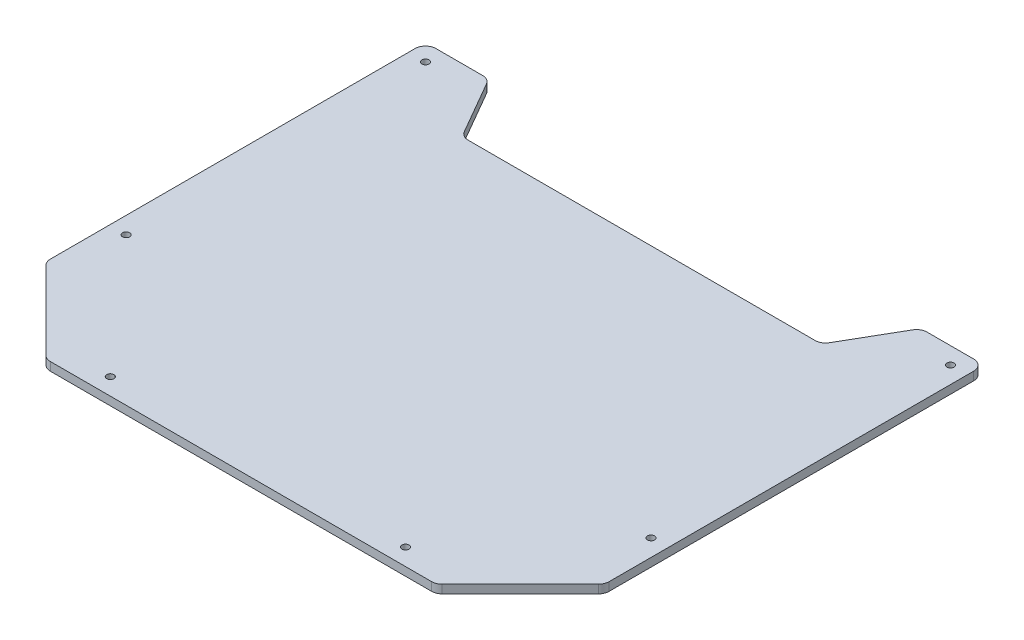
ISO-10303-21;
HEADER;
FILE_DESCRIPTION(('STEP AP214'),'2;1');
FILE_NAME('part.step','',(''),(''),'','','');
FILE_SCHEMA(('AUTOMOTIVE_DESIGN { 1 0 10303 214 1 1 1 1 }'));
ENDSEC;
DATA;
#1=APPLICATION_CONTEXT('core data for automotive mechanical design processes');
#2=APPLICATION_PROTOCOL_DEFINITION('international standard','automotive_design',2000,#1);
#3=PRODUCT_CONTEXT('',#1,'mechanical');
#4=PRODUCT('Part','Part','',(#3));
#5=PRODUCT_RELATED_PRODUCT_CATEGORY('part','',(#4));
#6=PRODUCT_DEFINITION_FORMATION('','',#4);
#7=PRODUCT_DEFINITION_CONTEXT('part definition',#1,'design');
#8=PRODUCT_DEFINITION('design','',#6,#7);
#9=PRODUCT_DEFINITION_SHAPE('','',#8);
#10=(LENGTH_UNIT() NAMED_UNIT(*) SI_UNIT(.MILLI.,.METRE.));
#11=(NAMED_UNIT(*) PLANE_ANGLE_UNIT() SI_UNIT($,.RADIAN.));
#12=(NAMED_UNIT(*) SI_UNIT($,.STERADIAN.) SOLID_ANGLE_UNIT());
#13=UNCERTAINTY_MEASURE_WITH_UNIT(LENGTH_MEASURE(1.E-05),#10,'distance_accuracy_value','');
#14=(GEOMETRIC_REPRESENTATION_CONTEXT(3) GLOBAL_UNCERTAINTY_ASSIGNED_CONTEXT((#13)) GLOBAL_UNIT_ASSIGNED_CONTEXT((#10,
#11,#12)) REPRESENTATION_CONTEXT('',''));
#15=CARTESIAN_POINT('',(0.,0.,0.));
#16=DIRECTION('',(0.,0.,1.));
#17=DIRECTION('',(1.,0.,0.));
#18=AXIS2_PLACEMENT_3D('',#15,#16,#17);
#19=CARTESIAN_POINT('',(0.,4.,0.));
#20=DIRECTION('',(0.,-1.,0.));
#21=DIRECTION('',(0.,0.,-1.));
#22=AXIS2_PLACEMENT_3D('',#19,#20,#21);
#23=PLANE('',#22);
#24=CARTESIAN_POINT('',(-70.,4.,-8.));
#25=DIRECTION('',(0.,1.,0.));
#26=DIRECTION('',(0.,0.,1.));
#27=AXIS2_PLACEMENT_3D('',#24,#25,#26);
#28=CIRCLE('',#27,1.69999999999999);
#29=CARTESIAN_POINT('',(-70.,4.,-6.30000000000001));
#30=VERTEX_POINT('',#29);
#31=EDGE_CURVE('E229',#30,#30,#28,.T.);
#32=ORIENTED_EDGE('',*,*,#31,.F.);
#33=EDGE_LOOP('',(#32));
#34=FACE_BOUND('',#33,.T.);
#35=CARTESIAN_POINT('',(70.,4.,-8.));
#36=DIRECTION('',(0.,1.,0.));
#37=DIRECTION('',(0.,0.,1.));
#38=AXIS2_PLACEMENT_3D('',#35,#36,#37);
#39=CIRCLE('',#38,1.69999999999999);
#40=CARTESIAN_POINT('',(70.,4.,-6.30000000000001));
#41=VERTEX_POINT('',#40);
#42=EDGE_CURVE('E224',#41,#41,#39,.T.);
#43=ORIENTED_EDGE('',*,*,#42,.F.);
#44=EDGE_LOOP('',(#43));
#45=FACE_BOUND('',#44,.T.);
#46=CARTESIAN_POINT('',(124.5,4.,-70.));
#47=DIRECTION('',(0.,1.,0.));
#48=DIRECTION('',(0.,0.,1.));
#49=AXIS2_PLACEMENT_3D('',#46,#47,#48);
#50=CIRCLE('',#49,1.69999999999998);
#51=CARTESIAN_POINT('',(124.5,4.,-68.3));
#52=VERTEX_POINT('',#51);
#53=EDGE_CURVE('E223',#52,#52,#50,.T.);
#54=ORIENTED_EDGE('',*,*,#53,.F.);
#55=EDGE_LOOP('',(#54));
#56=FACE_BOUND('',#55,.T.);
#57=CARTESIAN_POINT('',(124.5,4.,-212.));
#58=DIRECTION('',(0.,1.,0.));
#59=DIRECTION('',(0.,0.,1.));
#60=AXIS2_PLACEMENT_3D('',#57,#58,#59);
#61=CIRCLE('',#60,1.69999999999998);
#62=CARTESIAN_POINT('',(124.5,4.,-210.3));
#63=VERTEX_POINT('',#62);
#64=EDGE_CURVE('E492',#63,#63,#61,.T.);
#65=ORIENTED_EDGE('',*,*,#64,.F.);
#66=EDGE_LOOP('',(#65));
#67=FACE_BOUND('',#66,.T.);
#68=CARTESIAN_POINT('',(-124.5,4.,-212.));
#69=DIRECTION('',(0.,1.,0.));
#70=DIRECTION('',(0.,0.,1.));
#71=AXIS2_PLACEMENT_3D('',#68,#69,#70);
#72=CIRCLE('',#71,1.69999999999999);
#73=CARTESIAN_POINT('',(-124.5,4.,-210.3));
#74=VERTEX_POINT('',#73);
#75=EDGE_CURVE('E486',#74,#74,#72,.T.);
#76=ORIENTED_EDGE('',*,*,#75,.F.);
#77=EDGE_LOOP('',(#76));
#78=FACE_BOUND('',#77,.T.);
#79=DIRECTION('',(0.707106781186548,0.,-0.707106781186547));
#80=VECTOR('',#79,1.);
#81=CARTESIAN_POINT('',(92.5,4.,0.));
#82=LINE('',#81,#80);
#83=CARTESIAN_POINT('',(93.9644660940673,4.,-1.46446609406726));
#84=VERTEX_POINT('',#83);
#85=CARTESIAN_POINT('',(131.035533905933,4.,-38.5355339059327));
#86=VERTEX_POINT('',#85);
#87=EDGE_CURVE('E391',#84,#86,#82,.T.);
#88=ORIENTED_EDGE('',*,*,#87,.T.);
#89=CARTESIAN_POINT('',(127.5,4.,-42.0710678118655));
#90=DIRECTION('',(0.,-1.,0.));
#91=DIRECTION('',(0.,0.,-1.));
#92=AXIS2_PLACEMENT_3D('',#89,#90,#91);
#93=CIRCLE('',#92,5.);
#94=CARTESIAN_POINT('',(132.5,4.,-42.0710678118655));
#95=VERTEX_POINT('',#94);
#96=EDGE_CURVE('E276',#86,#95,#93,.F.);
#97=ORIENTED_EDGE('',*,*,#96,.T.);
#98=DIRECTION('',(0.,0.,-1.));
#99=VECTOR('',#98,1.);
#100=CARTESIAN_POINT('',(132.5,4.,-40.));
#101=LINE('',#100,#99);
#102=CARTESIAN_POINT('',(132.5,4.,-215.));
#103=VERTEX_POINT('',#102);
#104=EDGE_CURVE('E199',#95,#103,#101,.T.);
#105=ORIENTED_EDGE('',*,*,#104,.T.);
#106=CARTESIAN_POINT('',(127.5,4.,-215.));
#107=DIRECTION('',(0.,-1.,0.));
#108=DIRECTION('',(0.,0.,-1.));
#109=AXIS2_PLACEMENT_3D('',#106,#107,#108);
#110=CIRCLE('',#109,5.);
#111=CARTESIAN_POINT('',(127.5,4.,-220.));
#112=VERTEX_POINT('',#111);
#113=EDGE_CURVE('E256',#103,#112,#110,.F.);
#114=ORIENTED_EDGE('',*,*,#113,.T.);
#115=DIRECTION('',(-1.,0.,0.));
#116=VECTOR('',#115,1.);
#117=CARTESIAN_POINT('',(132.5,4.,-220.));
#118=LINE('',#117,#116);
#119=CARTESIAN_POINT('',(105.386751345948,4.,-220.));
#120=VERTEX_POINT('',#119);
#121=EDGE_CURVE('E207',#112,#120,#118,.T.);
#122=ORIENTED_EDGE('',*,*,#121,.T.);
#123=CARTESIAN_POINT('',(105.386751345948,4.,-215.));
#124=DIRECTION('',(0.,-1.,0.));
#125=DIRECTION('',(0.,0.,-1.));
#126=AXIS2_PLACEMENT_3D('',#123,#124,#125);
#127=CIRCLE('',#126,5.);
#128=CARTESIAN_POINT('',(101.056624327026,4.,-217.5));
#129=VERTEX_POINT('',#128);
#130=EDGE_CURVE('E259',#120,#129,#127,.F.);
#131=ORIENTED_EDGE('',*,*,#130,.T.);
#132=DIRECTION('',(-0.500000000000004,0.,0.866025403784436));
#133=VECTOR('',#132,1.);
#134=CARTESIAN_POINT('',(102.5,4.,-220.));
#135=LINE('',#134,#133);
#136=CARTESIAN_POINT('',(86.6228675972851,4.,-192.5));
#137=VERTEX_POINT('',#136);
#138=EDGE_CURVE('E213',#129,#137,#135,.T.);
#139=ORIENTED_EDGE('',*,*,#138,.T.);
#140=CARTESIAN_POINT('',(82.2927405783629,4.,-195.));
#141=DIRECTION('',(0.,-1.,0.));
#142=DIRECTION('',(0.,0.,-1.));
#143=AXIS2_PLACEMENT_3D('',#140,#141,#142);
#144=CIRCLE('',#143,5.);
#145=CARTESIAN_POINT('',(82.2927405783629,4.,-190.));
#146=VERTEX_POINT('',#145);
#147=EDGE_CURVE('E11',#137,#146,#144,.T.);
#148=ORIENTED_EDGE('',*,*,#147,.T.);
#149=DIRECTION('',(-1.,0.,0.));
#150=VECTOR('',#149,1.);
#151=CARTESIAN_POINT('',(85.179491924311,4.,-190.));
#152=LINE('',#151,#150);
#153=CARTESIAN_POINT('',(-82.2927405783629,4.,-190.));
#154=VERTEX_POINT('',#153);
#155=EDGE_CURVE('E363',#146,#154,#152,.T.);
#156=ORIENTED_EDGE('',*,*,#155,.T.);
#157=CARTESIAN_POINT('',(-82.2927405783629,4.,-195.));
#158=DIRECTION('',(0.,-1.,0.));
#159=DIRECTION('',(0.,0.,-1.));
#160=AXIS2_PLACEMENT_3D('',#157,#158,#159);
#161=CIRCLE('',#160,5.);
#162=CARTESIAN_POINT('',(-86.6228675972851,4.,-192.5));
#163=VERTEX_POINT('',#162);
#164=EDGE_CURVE('E337',#154,#163,#161,.T.);
#165=ORIENTED_EDGE('',*,*,#164,.T.);
#166=DIRECTION('',(-0.500000000000004,0.,-0.866025403784436));
#167=VECTOR('',#166,1.);
#168=CARTESIAN_POINT('',(-102.5,4.,-220.));
#169=LINE('',#168,#167);
#170=CARTESIAN_POINT('',(-101.056624327026,4.,-217.5));
#171=VERTEX_POINT('',#170);
#172=EDGE_CURVE('E369',#163,#171,#169,.T.);
#173=ORIENTED_EDGE('',*,*,#172,.T.);
#174=CARTESIAN_POINT('',(-105.386751345948,4.,-215.));
#175=DIRECTION('',(0.,-1.,0.));
#176=DIRECTION('',(0.,0.,-1.));
#177=AXIS2_PLACEMENT_3D('',#174,#175,#176);
#178=CIRCLE('',#177,5.);
#179=CARTESIAN_POINT('',(-105.386751345948,4.,-220.));
#180=VERTEX_POINT('',#179);
#181=EDGE_CURVE('E262',#171,#180,#178,.F.);
#182=ORIENTED_EDGE('',*,*,#181,.T.);
#183=DIRECTION('',(-1.,0.,0.));
#184=VECTOR('',#183,1.);
#185=CARTESIAN_POINT('',(-132.5,4.,-220.));
#186=LINE('',#185,#184);
#187=CARTESIAN_POINT('',(-127.5,4.,-220.));
#188=VERTEX_POINT('',#187);
#189=EDGE_CURVE('E374',#180,#188,#186,.T.);
#190=ORIENTED_EDGE('',*,*,#189,.T.);
#191=CARTESIAN_POINT('',(-127.5,4.,-215.));
#192=DIRECTION('',(0.,-1.,0.));
#193=DIRECTION('',(0.,0.,-1.));
#194=AXIS2_PLACEMENT_3D('',#191,#192,#193);
#195=CIRCLE('',#194,5.);
#196=CARTESIAN_POINT('',(-132.5,4.,-215.));
#197=VERTEX_POINT('',#196);
#198=EDGE_CURVE('E265',#188,#197,#195,.F.);
#199=ORIENTED_EDGE('',*,*,#198,.T.);
#200=DIRECTION('',(0.,0.,1.));
#201=VECTOR('',#200,1.);
#202=CARTESIAN_POINT('',(-132.5,4.,-40.));
#203=LINE('',#202,#201);
#204=CARTESIAN_POINT('',(-132.5,4.,-42.0710678118655));
#205=VERTEX_POINT('',#204);
#206=EDGE_CURVE('E381',#197,#205,#203,.T.);
#207=ORIENTED_EDGE('',*,*,#206,.T.);
#208=CARTESIAN_POINT('',(-127.5,4.,-42.0710678118655));
#209=DIRECTION('',(0.,-1.,0.));
#210=DIRECTION('',(0.,0.,-1.));
#211=AXIS2_PLACEMENT_3D('',#208,#209,#210);
#212=CIRCLE('',#211,5.);
#213=CARTESIAN_POINT('',(-131.035533905933,4.,-38.5355339059327));
#214=VERTEX_POINT('',#213);
#215=EDGE_CURVE('E268',#205,#214,#212,.F.);
#216=ORIENTED_EDGE('',*,*,#215,.T.);
#217=DIRECTION('',(0.707106781186548,0.,0.707106781186547));
#218=VECTOR('',#217,1.);
#219=CARTESIAN_POINT('',(-92.5,4.,0.));
#220=LINE('',#219,#218);
#221=CARTESIAN_POINT('',(-93.9644660940673,4.,-1.46446609406726));
#222=VERTEX_POINT('',#221);
#223=EDGE_CURVE('E385',#214,#222,#220,.T.);
#224=ORIENTED_EDGE('',*,*,#223,.T.);
#225=CARTESIAN_POINT('',(-90.4289321881345,4.,-5.));
#226=DIRECTION('',(0.,-1.,0.));
#227=DIRECTION('',(0.,0.,-1.));
#228=AXIS2_PLACEMENT_3D('',#225,#226,#227);
#229=CIRCLE('',#228,5.);
#230=CARTESIAN_POINT('',(-90.4289321881345,4.,0.));
#231=VERTEX_POINT('',#230);
#232=EDGE_CURVE('E62',#222,#231,#229,.F.);
#233=ORIENTED_EDGE('',*,*,#232,.T.);
#234=DIRECTION('',(1.,0.,0.));
#235=VECTOR('',#234,1.);
#236=CARTESIAN_POINT('',(-92.5,4.,0.));
#237=LINE('',#236,#235);
#238=CARTESIAN_POINT('',(90.4289321881345,4.,0.));
#239=VERTEX_POINT('',#238);
#240=EDGE_CURVE('E388',#231,#239,#237,.T.);
#241=ORIENTED_EDGE('',*,*,#240,.T.);
#242=CARTESIAN_POINT('',(90.4289321881345,4.,-5.));
#243=DIRECTION('',(0.,-1.,0.));
#244=DIRECTION('',(0.,0.,-1.));
#245=AXIS2_PLACEMENT_3D('',#242,#243,#244);
#246=CIRCLE('',#245,5.);
#247=EDGE_CURVE('E273',#239,#84,#246,.F.);
#248=ORIENTED_EDGE('',*,*,#247,.T.);
#249=EDGE_LOOP('',(#88,#97,#105,#114,#122,#131,#139,#148,#156,#165,#173,#182,#190,#199,#207,
#216,#224,#233,#241,#248));
#250=FACE_BOUND('',#249,.T.);
#251=CARTESIAN_POINT('',(-124.5,4.,-70.));
#252=DIRECTION('',(0.,1.,0.));
#253=DIRECTION('',(0.,0.,1.));
#254=AXIS2_PLACEMENT_3D('',#251,#252,#253);
#255=CIRCLE('',#254,1.69999999999999);
#256=CARTESIAN_POINT('',(-124.5,4.,-68.3));
#257=VERTEX_POINT('',#256);
#258=EDGE_CURVE('E478',#257,#257,#255,.T.);
#259=ORIENTED_EDGE('',*,*,#258,.F.);
#260=EDGE_LOOP('',(#259));
#261=FACE_BOUND('',#260,.T.);
#262=ADVANCED_FACE('F39',(#34,#45,#56,#67,#78,#250,#261),#23,.F.);
#263=CARTESIAN_POINT('',(132.5,4.,-220.));
#264=DIRECTION('',(0.,0.,1.));
#265=DIRECTION('',(1.,0.,0.));
#266=AXIS2_PLACEMENT_3D('',#263,#264,#265);
#267=PLANE('',#266);
#268=DIRECTION('',(-1.,0.,0.));
#269=VECTOR('',#268,1.);
#270=CARTESIAN_POINT('',(132.5,0.,-220.));
#271=LINE('',#270,#269);
#272=CARTESIAN_POINT('',(127.5,0.,-220.));
#273=VERTEX_POINT('',#272);
#274=CARTESIAN_POINT('',(105.386751345948,0.,-220.));
#275=VERTEX_POINT('',#274);
#276=EDGE_CURVE('E355',#273,#275,#271,.T.);
#277=ORIENTED_EDGE('',*,*,#276,.T.);
#278=DIRECTION('',(0.,-1.,0.));
#279=VECTOR('',#278,1.);
#280=CARTESIAN_POINT('',(105.386751345948,4.,-220.));
#281=LINE('',#280,#279);
#282=EDGE_CURVE('E331',#275,#120,#281,.F.);
#283=ORIENTED_EDGE('',*,*,#282,.T.);
#284=ORIENTED_EDGE('',*,*,#121,.F.);
#285=DIRECTION('',(0.,-1.,0.));
#286=VECTOR('',#285,1.);
#287=CARTESIAN_POINT('',(127.5,4.,-220.));
#288=LINE('',#287,#286);
#289=EDGE_CURVE('E327',#112,#273,#288,.T.);
#290=ORIENTED_EDGE('',*,*,#289,.T.);
#291=EDGE_LOOP('',(#277,#283,#284,#290));
#292=FACE_BOUND('',#291,.T.);
#293=ADVANCED_FACE('F438',(#292),#267,.F.);
#294=CARTESIAN_POINT('',(102.5,4.,-220.));
#295=DIRECTION('',(0.866025403784436,0.,0.500000000000004));
#296=DIRECTION('',(0.500000000000004,0.,-0.866025403784436));
#297=AXIS2_PLACEMENT_3D('',#294,#295,#296);
#298=PLANE('',#297);
#299=DIRECTION('',(-0.500000000000004,0.,0.866025403784436));
#300=VECTOR('',#299,1.);
#301=CARTESIAN_POINT('',(102.5,0.,-220.));
#302=LINE('',#301,#300);
#303=CARTESIAN_POINT('',(101.056624327026,0.,-217.5));
#304=VERTEX_POINT('',#303);
#305=CARTESIAN_POINT('',(86.6228675972851,0.,-192.5));
#306=VERTEX_POINT('',#305);
#307=EDGE_CURVE('E343',#304,#306,#302,.T.);
#308=ORIENTED_EDGE('',*,*,#307,.T.);
#309=DIRECTION('',(0.,-1.,0.));
#310=VECTOR('',#309,1.);
#311=CARTESIAN_POINT('',(86.6228675972851,4.,-192.5));
#312=LINE('',#311,#310);
#313=EDGE_CURVE('E324',#306,#137,#312,.F.);
#314=ORIENTED_EDGE('',*,*,#313,.T.);
#315=ORIENTED_EDGE('',*,*,#138,.F.);
#316=DIRECTION('',(0.,-1.,0.));
#317=VECTOR('',#316,1.);
#318=CARTESIAN_POINT('',(101.056624327026,4.,-217.5));
#319=LINE('',#318,#317);
#320=EDGE_CURVE('E320',#129,#304,#319,.T.);
#321=ORIENTED_EDGE('',*,*,#320,.T.);
#322=EDGE_LOOP('',(#308,#314,#315,#321));
#323=FACE_BOUND('',#322,.T.);
#324=ADVANCED_FACE('F350',(#323),#298,.F.);
#325=CARTESIAN_POINT('',(85.179491924311,4.,-190.));
#326=DIRECTION('',(0.,0.,1.));
#327=DIRECTION('',(1.,0.,0.));
#328=AXIS2_PLACEMENT_3D('',#325,#326,#327);
#329=PLANE('',#328);
#330=DIRECTION('',(-1.,0.,0.));
#331=VECTOR('',#330,1.);
#332=CARTESIAN_POINT('',(85.179491924311,0.,-190.));
#333=LINE('',#332,#331);
#334=CARTESIAN_POINT('',(82.2927405783629,0.,-190.));
#335=VERTEX_POINT('',#334);
#336=CARTESIAN_POINT('',(-82.2927405783629,0.,-190.));
#337=VERTEX_POINT('',#336);
#338=EDGE_CURVE('E345',#335,#337,#333,.T.);
#339=ORIENTED_EDGE('',*,*,#338,.T.);
#340=DIRECTION('',(0.,-1.,0.));
#341=VECTOR('',#340,1.);
#342=CARTESIAN_POINT('',(-82.2927405783629,4.,-190.));
#343=LINE('',#342,#341);
#344=EDGE_CURVE('E317',#337,#154,#343,.F.);
#345=ORIENTED_EDGE('',*,*,#344,.T.);
#346=ORIENTED_EDGE('',*,*,#155,.F.);
#347=DIRECTION('',(0.,-1.,0.));
#348=VECTOR('',#347,1.);
#349=CARTESIAN_POINT('',(82.2927405783629,0.,-190.));
#350=LINE('',#349,#348);
#351=EDGE_CURVE('E313',#146,#335,#350,.T.);
#352=ORIENTED_EDGE('',*,*,#351,.T.);
#353=EDGE_LOOP('',(#339,#345,#346,#352));
#354=FACE_BOUND('',#353,.T.);
#355=ADVANCED_FACE('F366',(#354),#329,.F.);
#356=CARTESIAN_POINT('',(-102.5,4.,-220.));
#357=DIRECTION('',(-0.866025403784436,0.,0.500000000000004));
#358=DIRECTION('',(0.500000000000004,0.,0.866025403784436));
#359=AXIS2_PLACEMENT_3D('',#356,#357,#358);
#360=PLANE('',#359);
#361=DIRECTION('',(-0.500000000000004,0.,-0.866025403784436));
#362=VECTOR('',#361,1.);
#363=CARTESIAN_POINT('',(-102.5,0.,-220.));
#364=LINE('',#363,#362);
#365=CARTESIAN_POINT('',(-86.6228675972851,0.,-192.5));
#366=VERTEX_POINT('',#365);
#367=CARTESIAN_POINT('',(-101.056624327026,0.,-217.5));
#368=VERTEX_POINT('',#367);
#369=EDGE_CURVE('E402',#366,#368,#364,.T.);
#370=ORIENTED_EDGE('',*,*,#369,.T.);
#371=DIRECTION('',(0.,-1.,0.));
#372=VECTOR('',#371,1.);
#373=CARTESIAN_POINT('',(-101.056624327026,4.,-217.5));
#374=LINE('',#373,#372);
#375=EDGE_CURVE('E310',#368,#171,#374,.F.);
#376=ORIENTED_EDGE('',*,*,#375,.T.);
#377=ORIENTED_EDGE('',*,*,#172,.F.);
#378=DIRECTION('',(0.,-1.,0.));
#379=VECTOR('',#378,1.);
#380=CARTESIAN_POINT('',(-86.6228675972851,0.,-192.5));
#381=LINE('',#380,#379);
#382=EDGE_CURVE('E306',#163,#366,#381,.T.);
#383=ORIENTED_EDGE('',*,*,#382,.T.);
#384=EDGE_LOOP('',(#370,#376,#377,#383));
#385=FACE_BOUND('',#384,.T.);
#386=ADVANCED_FACE('F582',(#385),#360,.F.);
#387=CARTESIAN_POINT('',(-132.5,4.,-220.));
#388=DIRECTION('',(0.,0.,1.));
#389=DIRECTION('',(1.,0.,0.));
#390=AXIS2_PLACEMENT_3D('',#387,#388,#389);
#391=PLANE('',#390);
#392=DIRECTION('',(-1.,0.,0.));
#393=VECTOR('',#392,1.);
#394=CARTESIAN_POINT('',(-132.5,0.,-220.));
#395=LINE('',#394,#393);
#396=CARTESIAN_POINT('',(-105.386751345948,0.,-220.));
#397=VERTEX_POINT('',#396);
#398=CARTESIAN_POINT('',(-127.5,0.,-220.));
#399=VERTEX_POINT('',#398);
#400=EDGE_CURVE('E406',#397,#399,#395,.T.);
#401=ORIENTED_EDGE('',*,*,#400,.T.);
#402=DIRECTION('',(0.,-1.,0.));
#403=VECTOR('',#402,1.);
#404=CARTESIAN_POINT('',(-127.5,4.,-220.));
#405=LINE('',#404,#403);
#406=EDGE_CURVE('E303',#399,#188,#405,.F.);
#407=ORIENTED_EDGE('',*,*,#406,.T.);
#408=ORIENTED_EDGE('',*,*,#189,.F.);
#409=DIRECTION('',(0.,-1.,0.));
#410=VECTOR('',#409,1.);
#411=CARTESIAN_POINT('',(-105.386751345948,4.,-220.));
#412=LINE('',#411,#410);
#413=EDGE_CURVE('E299',#180,#397,#412,.T.);
#414=ORIENTED_EDGE('',*,*,#413,.T.);
#415=EDGE_LOOP('',(#401,#407,#408,#414));
#416=FACE_BOUND('',#415,.T.);
#417=ADVANCED_FACE('F591',(#416),#391,.F.);
#418=CARTESIAN_POINT('',(-132.5,4.,-40.));
#419=DIRECTION('',(1.,0.,0.));
#420=DIRECTION('',(0.,0.,-1.));
#421=AXIS2_PLACEMENT_3D('',#418,#419,#420);
#422=PLANE('',#421);
#423=DIRECTION('',(0.,0.,1.));
#424=VECTOR('',#423,1.);
#425=CARTESIAN_POINT('',(-132.5,0.,-40.));
#426=LINE('',#425,#424);
#427=CARTESIAN_POINT('',(-132.5,0.,-215.));
#428=VERTEX_POINT('',#427);
#429=CARTESIAN_POINT('',(-132.5,0.,-42.0710678118655));
#430=VERTEX_POINT('',#429);
#431=EDGE_CURVE('E410',#428,#430,#426,.T.);
#432=ORIENTED_EDGE('',*,*,#431,.T.);
#433=DIRECTION('',(0.,-1.,0.));
#434=VECTOR('',#433,1.);
#435=CARTESIAN_POINT('',(-132.5,4.,-42.0710678118655));
#436=LINE('',#435,#434);
#437=EDGE_CURVE('E296',#430,#205,#436,.F.);
#438=ORIENTED_EDGE('',*,*,#437,.T.);
#439=ORIENTED_EDGE('',*,*,#206,.F.);
#440=DIRECTION('',(0.,-1.,0.));
#441=VECTOR('',#440,1.);
#442=CARTESIAN_POINT('',(-132.5,4.,-215.));
#443=LINE('',#442,#441);
#444=EDGE_CURVE('E292',#197,#428,#443,.T.);
#445=ORIENTED_EDGE('',*,*,#444,.T.);
#446=EDGE_LOOP('',(#432,#438,#439,#445));
#447=FACE_BOUND('',#446,.T.);
#448=ADVANCED_FACE('F601',(#447),#422,.F.);
#449=CARTESIAN_POINT('',(-92.5,4.,0.));
#450=DIRECTION('',(0.707106781186547,0.,-0.707106781186548));
#451=DIRECTION('',(-0.707106781186548,0.,-0.707106781186547));
#452=AXIS2_PLACEMENT_3D('',#449,#450,#451);
#453=PLANE('',#452);
#454=DIRECTION('',(0.707106781186548,0.,0.707106781186547));
#455=VECTOR('',#454,1.);
#456=CARTESIAN_POINT('',(-92.5,0.,0.));
#457=LINE('',#456,#455);
#458=CARTESIAN_POINT('',(-131.035533905933,0.,-38.5355339059327));
#459=VERTEX_POINT('',#458);
#460=CARTESIAN_POINT('',(-93.9644660940673,0.,-1.46446609406726));
#461=VERTEX_POINT('',#460);
#462=EDGE_CURVE('E414',#459,#461,#457,.T.);
#463=ORIENTED_EDGE('',*,*,#462,.T.);
#464=DIRECTION('',(0.,-1.,0.));
#465=VECTOR('',#464,1.);
#466=CARTESIAN_POINT('',(-93.9644660940673,4.,-1.46446609406726));
#467=LINE('',#466,#465);
#468=EDGE_CURVE('E289',#461,#222,#467,.F.);
#469=ORIENTED_EDGE('',*,*,#468,.T.);
#470=ORIENTED_EDGE('',*,*,#223,.F.);
#471=DIRECTION('',(0.,-1.,0.));
#472=VECTOR('',#471,1.);
#473=CARTESIAN_POINT('',(-131.035533905933,4.,-38.5355339059327));
#474=LINE('',#473,#472);
#475=EDGE_CURVE('E285',#214,#459,#474,.T.);
#476=ORIENTED_EDGE('',*,*,#475,.T.);
#477=EDGE_LOOP('',(#463,#469,#470,#476));
#478=FACE_BOUND('',#477,.T.);
#479=ADVANCED_FACE('F435',(#478),#453,.F.);
#480=CARTESIAN_POINT('',(-92.5,4.,0.));
#481=DIRECTION('',(0.,0.,-1.));
#482=DIRECTION('',(-1.,0.,0.));
#483=AXIS2_PLACEMENT_3D('',#480,#481,#482);
#484=PLANE('',#483);
#485=DIRECTION('',(1.,0.,0.));
#486=VECTOR('',#485,1.);
#487=CARTESIAN_POINT('',(-92.5,0.,0.));
#488=LINE('',#487,#486);
#489=CARTESIAN_POINT('',(-90.4289321881345,0.,0.));
#490=VERTEX_POINT('',#489);
#491=CARTESIAN_POINT('',(90.4289321881345,0.,0.));
#492=VERTEX_POINT('',#491);
#493=EDGE_CURVE('E215',#490,#492,#488,.T.);
#494=ORIENTED_EDGE('',*,*,#493,.T.);
#495=DIRECTION('',(0.,-1.,0.));
#496=VECTOR('',#495,1.);
#497=CARTESIAN_POINT('',(90.4289321881345,4.,0.));
#498=LINE('',#497,#496);
#499=EDGE_CURVE('E55',#492,#239,#498,.F.);
#500=ORIENTED_EDGE('',*,*,#499,.T.);
#501=ORIENTED_EDGE('',*,*,#240,.F.);
#502=DIRECTION('',(0.,-1.,0.));
#503=VECTOR('',#502,1.);
#504=CARTESIAN_POINT('',(-90.4289321881345,4.,0.));
#505=LINE('',#504,#503);
#506=EDGE_CURVE('E279',#231,#490,#505,.T.);
#507=ORIENTED_EDGE('',*,*,#506,.T.);
#508=EDGE_LOOP('',(#494,#500,#501,#507));
#509=FACE_BOUND('',#508,.T.);
#510=ADVANCED_FACE('F419',(#509),#484,.F.);
#511=CARTESIAN_POINT('',(92.5,4.,0.));
#512=DIRECTION('',(-0.707106781186547,0.,-0.707106781186548));
#513=DIRECTION('',(-0.707106781186548,0.,0.707106781186547));
#514=AXIS2_PLACEMENT_3D('',#511,#512,#513);
#515=PLANE('',#514);
#516=DIRECTION('',(0.707106781186548,0.,-0.707106781186547));
#517=VECTOR('',#516,1.);
#518=CARTESIAN_POINT('',(92.5,0.,0.));
#519=LINE('',#518,#517);
#520=CARTESIAN_POINT('',(93.9644660940673,0.,-1.46446609406726));
#521=VERTEX_POINT('',#520);
#522=CARTESIAN_POINT('',(131.035533905933,0.,-38.5355339059327));
#523=VERTEX_POINT('',#522);
#524=EDGE_CURVE('E208',#521,#523,#519,.T.);
#525=ORIENTED_EDGE('',*,*,#524,.T.);
#526=DIRECTION('',(0.,-1.,0.));
#527=VECTOR('',#526,1.);
#528=CARTESIAN_POINT('',(131.035533905933,4.,-38.5355339059327));
#529=LINE('',#528,#527);
#530=EDGE_CURVE('E183',#523,#86,#529,.F.);
#531=ORIENTED_EDGE('',*,*,#530,.T.);
#532=ORIENTED_EDGE('',*,*,#87,.F.);
#533=DIRECTION('',(0.,-1.,0.));
#534=VECTOR('',#533,1.);
#535=CARTESIAN_POINT('',(93.9644660940673,4.,-1.46446609406726));
#536=LINE('',#535,#534);
#537=EDGE_CURVE('E189',#84,#521,#536,.T.);
#538=ORIENTED_EDGE('',*,*,#537,.T.);
#539=EDGE_LOOP('',(#525,#531,#532,#538));
#540=FACE_BOUND('',#539,.T.);
#541=ADVANCED_FACE('F427',(#540),#515,.F.);
#542=CARTESIAN_POINT('',(132.5,4.,-40.));
#543=DIRECTION('',(-1.,0.,0.));
#544=DIRECTION('',(0.,0.,1.));
#545=AXIS2_PLACEMENT_3D('',#542,#543,#544);
#546=PLANE('',#545);
#547=ORIENTED_EDGE('',*,*,#104,.F.);
#548=DIRECTION('',(0.,-1.,0.));
#549=VECTOR('',#548,1.);
#550=CARTESIAN_POINT('',(132.5,4.,-42.0710678118655));
#551=LINE('',#550,#549);
#552=CARTESIAN_POINT('',(132.5,0.,-42.0710678118655));
#553=VERTEX_POINT('',#552);
#554=EDGE_CURVE('E182',#95,#553,#551,.T.);
#555=ORIENTED_EDGE('',*,*,#554,.T.);
#556=DIRECTION('',(0.,0.,-1.));
#557=VECTOR('',#556,1.);
#558=CARTESIAN_POINT('',(132.5,0.,-40.));
#559=LINE('',#558,#557);
#560=CARTESIAN_POINT('',(132.5,0.,-215.));
#561=VERTEX_POINT('',#560);
#562=EDGE_CURVE('E196',#553,#561,#559,.T.);
#563=ORIENTED_EDGE('',*,*,#562,.T.);
#564=DIRECTION('',(0.,-1.,0.));
#565=VECTOR('',#564,1.);
#566=CARTESIAN_POINT('',(132.5,4.,-215.));
#567=LINE('',#566,#565);
#568=EDGE_CURVE('E202',#561,#103,#567,.F.);
#569=ORIENTED_EDGE('',*,*,#568,.T.);
#570=EDGE_LOOP('',(#547,#555,#563,#569));
#571=FACE_BOUND('',#570,.T.);
#572=ADVANCED_FACE('F195',(#571),#546,.F.);
#573=CARTESIAN_POINT('',(0.,0.,0.));
#574=DIRECTION('',(0.,-1.,0.));
#575=DIRECTION('',(0.,0.,-1.));
#576=AXIS2_PLACEMENT_3D('',#573,#574,#575);
#577=PLANE('',#576);
#578=CARTESIAN_POINT('',(-70.,0.,-8.));
#579=DIRECTION('',(0.,-1.,0.));
#580=DIRECTION('',(0.,0.,-1.));
#581=AXIS2_PLACEMENT_3D('',#578,#579,#580);
#582=CIRCLE('',#581,1.69999999999999);
#583=CARTESIAN_POINT('',(-70.,0.,-9.69999999999999));
#584=VERTEX_POINT('',#583);
#585=EDGE_CURVE('E225',#584,#584,#582,.T.);
#586=ORIENTED_EDGE('',*,*,#585,.F.);
#587=EDGE_LOOP('',(#586));
#588=FACE_BOUND('',#587,.T.);
#589=CARTESIAN_POINT('',(70.,0.,-8.));
#590=DIRECTION('',(0.,-1.,0.));
#591=DIRECTION('',(0.,0.,-1.));
#592=AXIS2_PLACEMENT_3D('',#589,#590,#591);
#593=CIRCLE('',#592,1.69999999999999);
#594=CARTESIAN_POINT('',(70.,0.,-9.69999999999999));
#595=VERTEX_POINT('',#594);
#596=EDGE_CURVE('E219',#595,#595,#593,.T.);
#597=ORIENTED_EDGE('',*,*,#596,.F.);
#598=EDGE_LOOP('',(#597));
#599=FACE_BOUND('',#598,.T.);
#600=CARTESIAN_POINT('',(124.5,0.,-70.));
#601=DIRECTION('',(0.,-1.,0.));
#602=DIRECTION('',(0.,0.,-1.));
#603=AXIS2_PLACEMENT_3D('',#600,#601,#602);
#604=CIRCLE('',#603,1.69999999999998);
#605=CARTESIAN_POINT('',(124.5,0.,-71.7));
#606=VERTEX_POINT('',#605);
#607=EDGE_CURVE('E466',#606,#606,#604,.T.);
#608=ORIENTED_EDGE('',*,*,#607,.F.);
#609=EDGE_LOOP('',(#608));
#610=FACE_BOUND('',#609,.T.);
#611=CARTESIAN_POINT('',(124.5,0.,-212.));
#612=DIRECTION('',(0.,-1.,0.));
#613=DIRECTION('',(0.,0.,-1.));
#614=AXIS2_PLACEMENT_3D('',#611,#612,#613);
#615=CIRCLE('',#614,1.69999999999998);
#616=CARTESIAN_POINT('',(124.5,0.,-213.7));
#617=VERTEX_POINT('',#616);
#618=EDGE_CURVE('E470',#617,#617,#615,.T.);
#619=ORIENTED_EDGE('',*,*,#618,.F.);
#620=EDGE_LOOP('',(#619));
#621=FACE_BOUND('',#620,.T.);
#622=CARTESIAN_POINT('',(-124.5,0.,-212.));
#623=DIRECTION('',(0.,-1.,0.));
#624=DIRECTION('',(0.,0.,-1.));
#625=AXIS2_PLACEMENT_3D('',#622,#623,#624);
#626=CIRCLE('',#625,1.69999999999999);
#627=CARTESIAN_POINT('',(-124.5,0.,-213.7));
#628=VERTEX_POINT('',#627);
#629=EDGE_CURVE('E474',#628,#628,#626,.T.);
#630=ORIENTED_EDGE('',*,*,#629,.F.);
#631=EDGE_LOOP('',(#630));
#632=FACE_BOUND('',#631,.T.);
#633=CARTESIAN_POINT('',(-124.5,0.,-70.));
#634=DIRECTION('',(0.,-1.,0.));
#635=DIRECTION('',(0.,0.,-1.));
#636=AXIS2_PLACEMENT_3D('',#633,#634,#635);
#637=CIRCLE('',#636,1.69999999999999);
#638=CARTESIAN_POINT('',(-124.5,0.,-71.7));
#639=VERTEX_POINT('',#638);
#640=EDGE_CURVE('E398',#639,#639,#637,.T.);
#641=ORIENTED_EDGE('',*,*,#640,.F.);
#642=EDGE_LOOP('',(#641));
#643=FACE_BOUND('',#642,.T.);
#644=ORIENTED_EDGE('',*,*,#562,.F.);
#645=CARTESIAN_POINT('',(127.5,0.,-42.0710678118655));
#646=DIRECTION('',(0.,-1.,0.));
#647=DIRECTION('',(0.,0.,-1.));
#648=AXIS2_PLACEMENT_3D('',#645,#646,#647);
#649=CIRCLE('',#648,5.);
#650=EDGE_CURVE('E178',#553,#523,#649,.T.);
#651=ORIENTED_EDGE('',*,*,#650,.T.);
#652=ORIENTED_EDGE('',*,*,#524,.F.);
#653=CARTESIAN_POINT('',(90.4289321881345,0.,-5.));
#654=DIRECTION('',(0.,-1.,0.));
#655=DIRECTION('',(0.,0.,-1.));
#656=AXIS2_PLACEMENT_3D('',#653,#654,#655);
#657=CIRCLE('',#656,5.);
#658=EDGE_CURVE('E190',#521,#492,#657,.T.);
#659=ORIENTED_EDGE('',*,*,#658,.T.);
#660=ORIENTED_EDGE('',*,*,#493,.F.);
#661=CARTESIAN_POINT('',(-90.4289321881345,0.,-5.));
#662=DIRECTION('',(0.,-1.,0.));
#663=DIRECTION('',(0.,0.,-1.));
#664=AXIS2_PLACEMENT_3D('',#661,#662,#663);
#665=CIRCLE('',#664,5.);
#666=EDGE_CURVE('E246',#490,#461,#665,.T.);
#667=ORIENTED_EDGE('',*,*,#666,.T.);
#668=ORIENTED_EDGE('',*,*,#462,.F.);
#669=CARTESIAN_POINT('',(-127.5,0.,-42.0710678118655));
#670=DIRECTION('',(0.,-1.,0.));
#671=DIRECTION('',(0.,0.,-1.));
#672=AXIS2_PLACEMENT_3D('',#669,#670,#671);
#673=CIRCLE('',#672,5.);
#674=EDGE_CURVE('E243',#459,#430,#673,.T.);
#675=ORIENTED_EDGE('',*,*,#674,.T.);
#676=ORIENTED_EDGE('',*,*,#431,.F.);
#677=CARTESIAN_POINT('',(-127.5,0.,-215.));
#678=DIRECTION('',(0.,-1.,0.));
#679=DIRECTION('',(0.,0.,-1.));
#680=AXIS2_PLACEMENT_3D('',#677,#678,#679);
#681=CIRCLE('',#680,5.);
#682=EDGE_CURVE('E240',#428,#399,#681,.T.);
#683=ORIENTED_EDGE('',*,*,#682,.T.);
#684=ORIENTED_EDGE('',*,*,#400,.F.);
#685=CARTESIAN_POINT('',(-105.386751345948,0.,-215.));
#686=DIRECTION('',(0.,-1.,0.));
#687=DIRECTION('',(0.,0.,-1.));
#688=AXIS2_PLACEMENT_3D('',#685,#686,#687);
#689=CIRCLE('',#688,5.);
#690=EDGE_CURVE('E237',#397,#368,#689,.T.);
#691=ORIENTED_EDGE('',*,*,#690,.T.);
#692=ORIENTED_EDGE('',*,*,#369,.F.);
#693=CARTESIAN_POINT('',(-82.2927405783629,0.,-195.));
#694=DIRECTION('',(0.,-1.,0.));
#695=DIRECTION('',(0.,0.,-1.));
#696=AXIS2_PLACEMENT_3D('',#693,#694,#695);
#697=CIRCLE('',#696,5.);
#698=EDGE_CURVE('E334',#366,#337,#697,.F.);
#699=ORIENTED_EDGE('',*,*,#698,.T.);
#700=ORIENTED_EDGE('',*,*,#338,.F.);
#701=CARTESIAN_POINT('',(82.2927405783629,0.,-195.));
#702=DIRECTION('',(0.,-1.,0.));
#703=DIRECTION('',(0.,0.,-1.));
#704=AXIS2_PLACEMENT_3D('',#701,#702,#703);
#705=CIRCLE('',#704,5.);
#706=EDGE_CURVE('E48',#335,#306,#705,.F.);
#707=ORIENTED_EDGE('',*,*,#706,.T.);
#708=ORIENTED_EDGE('',*,*,#307,.F.);
#709=CARTESIAN_POINT('',(105.386751345948,0.,-215.));
#710=DIRECTION('',(0.,-1.,0.));
#711=DIRECTION('',(0.,0.,-1.));
#712=AXIS2_PLACEMENT_3D('',#709,#710,#711);
#713=CIRCLE('',#712,5.);
#714=EDGE_CURVE('E234',#304,#275,#713,.T.);
#715=ORIENTED_EDGE('',*,*,#714,.T.);
#716=ORIENTED_EDGE('',*,*,#276,.F.);
#717=CARTESIAN_POINT('',(127.5,0.,-215.));
#718=DIRECTION('',(0.,-1.,0.));
#719=DIRECTION('',(0.,0.,-1.));
#720=AXIS2_PLACEMENT_3D('',#717,#718,#719);
#721=CIRCLE('',#720,5.);
#722=EDGE_CURVE('E201',#273,#561,#721,.T.);
#723=ORIENTED_EDGE('',*,*,#722,.T.);
#724=EDGE_LOOP('',(#644,#651,#652,#659,#660,#667,#668,#675,#676,#683,#684,#691,#692,#699,#700,
#707,#708,#715,#716,#723));
#725=FACE_BOUND('',#724,.T.);
#726=ADVANCED_FACE('F204',(#588,#599,#610,#621,#632,#643,#725),#577,.T.);
#727=CARTESIAN_POINT('',(-124.5,4.,-70.));
#728=DIRECTION('',(0.,1.,0.));
#729=DIRECTION('',(0.,0.,1.));
#730=AXIS2_PLACEMENT_3D('',#727,#728,#729);
#731=CYLINDRICAL_SURFACE('',#730,1.69999999999999);
#732=ORIENTED_EDGE('',*,*,#640,.T.);
#733=EDGE_LOOP('',(#732));
#734=FACE_BOUND('',#733,.T.);
#735=ORIENTED_EDGE('',*,*,#258,.T.);
#736=EDGE_LOOP('',(#735));
#737=FACE_BOUND('',#736,.T.);
#738=ADVANCED_FACE('F450',(#734,#737),#731,.F.);
#739=CARTESIAN_POINT('',(-124.5,4.,-212.));
#740=DIRECTION('',(0.,1.,0.));
#741=DIRECTION('',(0.,0.,1.));
#742=AXIS2_PLACEMENT_3D('',#739,#740,#741);
#743=CYLINDRICAL_SURFACE('',#742,1.69999999999999);
#744=ORIENTED_EDGE('',*,*,#629,.T.);
#745=EDGE_LOOP('',(#744));
#746=FACE_BOUND('',#745,.T.);
#747=ORIENTED_EDGE('',*,*,#75,.T.);
#748=EDGE_LOOP('',(#747));
#749=FACE_BOUND('',#748,.T.);
#750=ADVANCED_FACE('F457',(#746,#749),#743,.F.);
#751=CARTESIAN_POINT('',(124.5,4.,-212.));
#752=DIRECTION('',(0.,1.,0.));
#753=DIRECTION('',(0.,0.,1.));
#754=AXIS2_PLACEMENT_3D('',#751,#752,#753);
#755=CYLINDRICAL_SURFACE('',#754,1.69999999999998);
#756=ORIENTED_EDGE('',*,*,#618,.T.);
#757=EDGE_LOOP('',(#756));
#758=FACE_BOUND('',#757,.T.);
#759=ORIENTED_EDGE('',*,*,#64,.T.);
#760=EDGE_LOOP('',(#759));
#761=FACE_BOUND('',#760,.T.);
#762=ADVANCED_FACE('F523',(#758,#761),#755,.F.);
#763=CARTESIAN_POINT('',(124.5,4.,-70.));
#764=DIRECTION('',(0.,1.,0.));
#765=DIRECTION('',(0.,0.,1.));
#766=AXIS2_PLACEMENT_3D('',#763,#764,#765);
#767=CYLINDRICAL_SURFACE('',#766,1.69999999999998);
#768=ORIENTED_EDGE('',*,*,#607,.T.);
#769=EDGE_LOOP('',(#768));
#770=FACE_BOUND('',#769,.T.);
#771=ORIENTED_EDGE('',*,*,#53,.T.);
#772=EDGE_LOOP('',(#771));
#773=FACE_BOUND('',#772,.T.);
#774=ADVANCED_FACE('F517',(#770,#773),#767,.F.);
#775=CARTESIAN_POINT('',(70.,4.,-8.));
#776=DIRECTION('',(0.,1.,0.));
#777=DIRECTION('',(0.,0.,1.));
#778=AXIS2_PLACEMENT_3D('',#775,#776,#777);
#779=CYLINDRICAL_SURFACE('',#778,1.69999999999999);
#780=ORIENTED_EDGE('',*,*,#596,.T.);
#781=EDGE_LOOP('',(#780));
#782=FACE_BOUND('',#781,.T.);
#783=ORIENTED_EDGE('',*,*,#42,.T.);
#784=EDGE_LOOP('',(#783));
#785=FACE_BOUND('',#784,.T.);
#786=ADVANCED_FACE('F509',(#782,#785),#779,.F.);
#787=CARTESIAN_POINT('',(-70.,4.,-8.));
#788=DIRECTION('',(0.,1.,0.));
#789=DIRECTION('',(0.,0.,1.));
#790=AXIS2_PLACEMENT_3D('',#787,#788,#789);
#791=CYLINDRICAL_SURFACE('',#790,1.69999999999999);
#792=ORIENTED_EDGE('',*,*,#585,.T.);
#793=EDGE_LOOP('',(#792));
#794=FACE_BOUND('',#793,.T.);
#795=ORIENTED_EDGE('',*,*,#31,.T.);
#796=EDGE_LOOP('',(#795));
#797=FACE_BOUND('',#796,.T.);
#798=ADVANCED_FACE('F507',(#794,#797),#791,.F.);
#799=CARTESIAN_POINT('',(127.5,4.,-42.0710678118655));
#800=DIRECTION('',(0.,-1.,0.));
#801=DIRECTION('',(0.,0.,-1.));
#802=AXIS2_PLACEMENT_3D('',#799,#800,#801);
#803=CYLINDRICAL_SURFACE('',#802,5.);
#804=ORIENTED_EDGE('',*,*,#96,.F.);
#805=ORIENTED_EDGE('',*,*,#530,.F.);
#806=ORIENTED_EDGE('',*,*,#650,.F.);
#807=ORIENTED_EDGE('',*,*,#554,.F.);
#808=EDGE_LOOP('',(#804,#805,#806,#807));
#809=FACE_BOUND('',#808,.T.);
#810=ADVANCED_FACE('F181',(#809),#803,.T.);
#811=CARTESIAN_POINT('',(90.4289321881345,4.,-5.));
#812=DIRECTION('',(0.,-1.,0.));
#813=DIRECTION('',(0.,0.,-1.));
#814=AXIS2_PLACEMENT_3D('',#811,#812,#813);
#815=CYLINDRICAL_SURFACE('',#814,5.);
#816=ORIENTED_EDGE('',*,*,#247,.F.);
#817=ORIENTED_EDGE('',*,*,#499,.F.);
#818=ORIENTED_EDGE('',*,*,#658,.F.);
#819=ORIENTED_EDGE('',*,*,#537,.F.);
#820=EDGE_LOOP('',(#816,#817,#818,#819));
#821=FACE_BOUND('',#820,.T.);
#822=ADVANCED_FACE('F423',(#821),#815,.T.);
#823=CARTESIAN_POINT('',(-90.4289321881345,4.,-5.));
#824=DIRECTION('',(0.,-1.,0.));
#825=DIRECTION('',(0.,0.,-1.));
#826=AXIS2_PLACEMENT_3D('',#823,#824,#825);
#827=CYLINDRICAL_SURFACE('',#826,5.);
#828=ORIENTED_EDGE('',*,*,#232,.F.);
#829=ORIENTED_EDGE('',*,*,#468,.F.);
#830=ORIENTED_EDGE('',*,*,#666,.F.);
#831=ORIENTED_EDGE('',*,*,#506,.F.);
#832=EDGE_LOOP('',(#828,#829,#830,#831));
#833=FACE_BOUND('',#832,.T.);
#834=ADVANCED_FACE('F653',(#833),#827,.T.);
#835=CARTESIAN_POINT('',(-127.5,4.,-42.0710678118655));
#836=DIRECTION('',(0.,-1.,0.));
#837=DIRECTION('',(0.,0.,-1.));
#838=AXIS2_PLACEMENT_3D('',#835,#836,#837);
#839=CYLINDRICAL_SURFACE('',#838,5.);
#840=ORIENTED_EDGE('',*,*,#215,.F.);
#841=ORIENTED_EDGE('',*,*,#437,.F.);
#842=ORIENTED_EDGE('',*,*,#674,.F.);
#843=ORIENTED_EDGE('',*,*,#475,.F.);
#844=EDGE_LOOP('',(#840,#841,#842,#843));
#845=FACE_BOUND('',#844,.T.);
#846=ADVANCED_FACE('F662',(#845),#839,.T.);
#847=CARTESIAN_POINT('',(-127.5,4.,-215.));
#848=DIRECTION('',(0.,-1.,0.));
#849=DIRECTION('',(0.,0.,-1.));
#850=AXIS2_PLACEMENT_3D('',#847,#848,#849);
#851=CYLINDRICAL_SURFACE('',#850,5.);
#852=ORIENTED_EDGE('',*,*,#198,.F.);
#853=ORIENTED_EDGE('',*,*,#406,.F.);
#854=ORIENTED_EDGE('',*,*,#682,.F.);
#855=ORIENTED_EDGE('',*,*,#444,.F.);
#856=EDGE_LOOP('',(#852,#853,#854,#855));
#857=FACE_BOUND('',#856,.T.);
#858=ADVANCED_FACE('F672',(#857),#851,.T.);
#859=CARTESIAN_POINT('',(-105.386751345948,4.,-215.));
#860=DIRECTION('',(0.,-1.,0.));
#861=DIRECTION('',(0.,0.,-1.));
#862=AXIS2_PLACEMENT_3D('',#859,#860,#861);
#863=CYLINDRICAL_SURFACE('',#862,5.);
#864=ORIENTED_EDGE('',*,*,#181,.F.);
#865=ORIENTED_EDGE('',*,*,#375,.F.);
#866=ORIENTED_EDGE('',*,*,#690,.F.);
#867=ORIENTED_EDGE('',*,*,#413,.F.);
#868=EDGE_LOOP('',(#864,#865,#866,#867));
#869=FACE_BOUND('',#868,.T.);
#870=ADVANCED_FACE('F682',(#869),#863,.T.);
#871=CARTESIAN_POINT('',(-82.2927405783629,4.,-195.));
#872=DIRECTION('',(0.,1.,0.));
#873=DIRECTION('',(0.,0.,1.));
#874=AXIS2_PLACEMENT_3D('',#871,#872,#873);
#875=CYLINDRICAL_SURFACE('',#874,5.);
#876=ORIENTED_EDGE('',*,*,#164,.F.);
#877=ORIENTED_EDGE('',*,*,#344,.F.);
#878=ORIENTED_EDGE('',*,*,#698,.F.);
#879=ORIENTED_EDGE('',*,*,#382,.F.);
#880=EDGE_LOOP('',(#876,#877,#878,#879));
#881=FACE_BOUND('',#880,.T.);
#882=ADVANCED_FACE('F692',(#881),#875,.F.);
#883=CARTESIAN_POINT('',(82.2927405783629,4.,-195.));
#884=DIRECTION('',(0.,1.,0.));
#885=DIRECTION('',(0.,0.,1.));
#886=AXIS2_PLACEMENT_3D('',#883,#884,#885);
#887=CYLINDRICAL_SURFACE('',#886,5.);
#888=ORIENTED_EDGE('',*,*,#147,.F.);
#889=ORIENTED_EDGE('',*,*,#313,.F.);
#890=ORIENTED_EDGE('',*,*,#706,.F.);
#891=ORIENTED_EDGE('',*,*,#351,.F.);
#892=EDGE_LOOP('',(#888,#889,#890,#891));
#893=FACE_BOUND('',#892,.T.);
#894=ADVANCED_FACE('F358',(#893),#887,.F.);
#895=CARTESIAN_POINT('',(105.386751345948,4.,-215.));
#896=DIRECTION('',(0.,-1.,0.));
#897=DIRECTION('',(0.,0.,-1.));
#898=AXIS2_PLACEMENT_3D('',#895,#896,#897);
#899=CYLINDRICAL_SURFACE('',#898,5.);
#900=ORIENTED_EDGE('',*,*,#130,.F.);
#901=ORIENTED_EDGE('',*,*,#282,.F.);
#902=ORIENTED_EDGE('',*,*,#714,.F.);
#903=ORIENTED_EDGE('',*,*,#320,.F.);
#904=EDGE_LOOP('',(#900,#901,#902,#903));
#905=FACE_BOUND('',#904,.T.);
#906=ADVANCED_FACE('F711',(#905),#899,.T.);
#907=CARTESIAN_POINT('',(127.5,4.,-215.));
#908=DIRECTION('',(0.,-1.,0.));
#909=DIRECTION('',(0.,0.,-1.));
#910=AXIS2_PLACEMENT_3D('',#907,#908,#909);
#911=CYLINDRICAL_SURFACE('',#910,5.);
#912=ORIENTED_EDGE('',*,*,#113,.F.);
#913=ORIENTED_EDGE('',*,*,#568,.F.);
#914=ORIENTED_EDGE('',*,*,#722,.F.);
#915=ORIENTED_EDGE('',*,*,#289,.F.);
#916=EDGE_LOOP('',(#912,#913,#914,#915));
#917=FACE_BOUND('',#916,.T.);
#918=ADVANCED_FACE('F41',(#917),#911,.T.);
#919=CLOSED_SHELL('',(#262,#293,#324,#355,#386,#417,#448,#479,#510,#541,#572,#726,#738,#750,
#762,#774,#786,#798,#810,#822,#834,#846,#858,#870,#882,#894,#906,#918));
#920=MANIFOLD_SOLID_BREP('B2',#919);
#921=ADVANCED_BREP_SHAPE_REPRESENTATION('',(#18,#920),#14);
#922=SHAPE_DEFINITION_REPRESENTATION(#9,#921);
ENDSEC;
END-ISO-10303-21;
